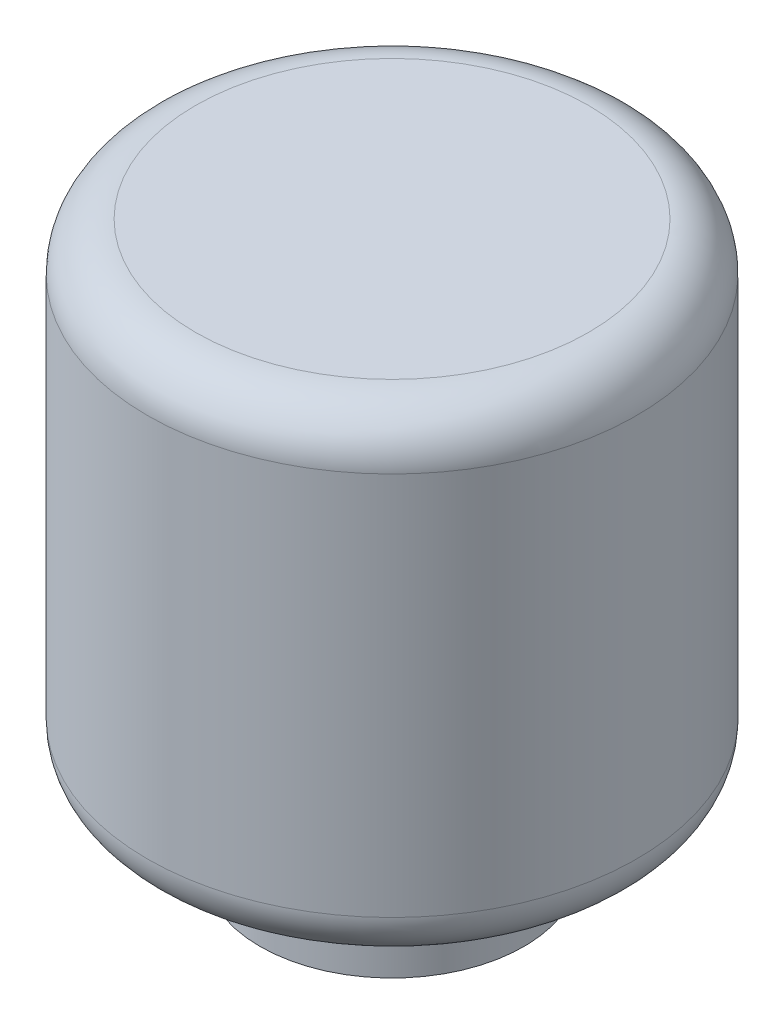
ISO-10303-21;
HEADER;
FILE_DESCRIPTION(('STEP AP214'),'2;1');
FILE_NAME('part.step','',(''),(''),'','','');
FILE_SCHEMA(('AUTOMOTIVE_DESIGN { 1 0 10303 214 1 1 1 1 }'));
ENDSEC;
DATA;
#1=APPLICATION_CONTEXT('core data for automotive mechanical design processes');
#2=APPLICATION_PROTOCOL_DEFINITION('international standard','automotive_design',2000,#1);
#3=PRODUCT_CONTEXT('',#1,'mechanical');
#4=PRODUCT('Part','Part','',(#3));
#5=PRODUCT_RELATED_PRODUCT_CATEGORY('part','',(#4));
#6=PRODUCT_DEFINITION_FORMATION('','',#4);
#7=PRODUCT_DEFINITION_CONTEXT('part definition',#1,'design');
#8=PRODUCT_DEFINITION('design','',#6,#7);
#9=PRODUCT_DEFINITION_SHAPE('','',#8);
#10=(LENGTH_UNIT() NAMED_UNIT(*) SI_UNIT(.MILLI.,.METRE.));
#11=(NAMED_UNIT(*) PLANE_ANGLE_UNIT() SI_UNIT($,.RADIAN.));
#12=(NAMED_UNIT(*) SI_UNIT($,.STERADIAN.) SOLID_ANGLE_UNIT());
#13=UNCERTAINTY_MEASURE_WITH_UNIT(LENGTH_MEASURE(1.E-05),#10,'distance_accuracy_value','');
#14=(GEOMETRIC_REPRESENTATION_CONTEXT(3) GLOBAL_UNCERTAINTY_ASSIGNED_CONTEXT((#13)) GLOBAL_UNIT_ASSIGNED_CONTEXT((#10,
#11,#12)) REPRESENTATION_CONTEXT('',''));
#15=CARTESIAN_POINT('',(0.,0.,0.));
#16=DIRECTION('',(0.,0.,1.));
#17=DIRECTION('',(1.,0.,0.));
#18=AXIS2_PLACEMENT_3D('',#15,#16,#17);
#19=CARTESIAN_POINT('',(0.,-6.68754044623082,0.));
#20=DIRECTION('',(0.,-1.,0.));
#21=DIRECTION('',(0.,0.,-1.));
#22=AXIS2_PLACEMENT_3D('',#19,#20,#21);
#23=CYLINDRICAL_SURFACE('',#22,9.37037036620576);
#24=CARTESIAN_POINT('',(0.,-6.68754044623082,0.));
#25=DIRECTION('',(0.,1.,0.));
#26=DIRECTION('',(0.,0.,1.));
#27=AXIS2_PLACEMENT_3D('',#24,#25,#26);
#28=CIRCLE('',#27,9.37037036620576);
#29=CARTESIAN_POINT('',(0.,-6.68754044623082,9.37037036620576));
#30=VERTEX_POINT('',#29);
#31=EDGE_CURVE('E59',#30,#30,#28,.T.);
#32=ORIENTED_EDGE('',*,*,#31,.F.);
#33=EDGE_LOOP('',(#32));
#34=FACE_BOUND('',#33,.T.);
#35=CARTESIAN_POINT('',(0.,-9.24309600065057,0.));
#36=DIRECTION('',(0.,1.,0.));
#37=DIRECTION('',(0.,0.,1.));
#38=AXIS2_PLACEMENT_3D('',#35,#36,#37);
#39=CIRCLE('',#38,9.37037036620576);
#40=CARTESIAN_POINT('',(0.,-9.24309600065057,9.37037036620576));
#41=VERTEX_POINT('',#40);
#42=EDGE_CURVE('E56',#41,#41,#39,.T.);
#43=ORIENTED_EDGE('',*,*,#42,.T.);
#44=EDGE_LOOP('',(#43));
#45=FACE_BOUND('',#44,.T.);
#46=ADVANCED_FACE('F32',(#34,#45),#23,.T.);
#47=CARTESIAN_POINT('',(0.,-6.68754044623082,0.));
#48=DIRECTION('',(0.,1.,0.));
#49=DIRECTION('',(0.,0.,1.));
#50=AXIS2_PLACEMENT_3D('',#47,#48,#49);
#51=PLANE('',#50);
#52=CARTESIAN_POINT('',(0.,-6.68754044623082,0.));
#53=DIRECTION('',(0.,1.,0.));
#54=DIRECTION('',(0.,0.,1.));
#55=AXIS2_PLACEMENT_3D('',#52,#53,#54);
#56=CIRCLE('',#55,4.25925925736625);
#57=CARTESIAN_POINT('',(0.,-6.68754044623082,4.25925925736625));
#58=VERTEX_POINT('',#57);
#59=EDGE_CURVE('E55',#58,#58,#56,.T.);
#60=ORIENTED_EDGE('',*,*,#59,.F.);
#61=EDGE_LOOP('',(#60));
#62=FACE_BOUND('',#61,.T.);
#63=ORIENTED_EDGE('',*,*,#31,.T.);
#64=EDGE_LOOP('',(#63));
#65=FACE_BOUND('',#64,.T.);
#66=ADVANCED_FACE('F67',(#62,#65),#51,.T.);
#67=CARTESIAN_POINT('',(0.,-9.24309600065057,0.));
#68=DIRECTION('',(0.,1.,0.));
#69=DIRECTION('',(0.,0.,1.));
#70=AXIS2_PLACEMENT_3D('',#67,#68,#69);
#71=PLANE('',#70);
#72=ORIENTED_EDGE('',*,*,#42,.F.);
#73=EDGE_LOOP('',(#72));
#74=FACE_BOUND('',#73,.T.);
#75=ADVANCED_FACE('F70',(#74),#71,.F.);
#76=CARTESIAN_POINT('',(0.,30.7939410185922,0.));
#77=DIRECTION('',(0.,-1.,0.));
#78=DIRECTION('',(0.,0.,-1.));
#79=AXIS2_PLACEMENT_3D('',#76,#77,#78);
#80=CYLINDRICAL_SURFACE('',#79,17.3586592391877);
#81=CARTESIAN_POINT('',(0.,0.127274365555188,0.));
#82=DIRECTION('',(0.,1.,0.));
#83=DIRECTION('',(0.,0.,1.));
#84=AXIS2_PLACEMENT_3D('',#81,#82,#83);
#85=CIRCLE('',#84,17.3586592391877);
#86=CARTESIAN_POINT('',(0.,0.127274365555188,17.3586592391877));
#87=VERTEX_POINT('',#86);
#88=EDGE_CURVE('E43',#87,#87,#85,.T.);
#89=ORIENTED_EDGE('',*,*,#88,.T.);
#90=EDGE_LOOP('',(#89));
#91=FACE_BOUND('',#90,.T.);
#92=CARTESIAN_POINT('',(0.,27.3865336126992,0.));
#93=DIRECTION('',(0.,1.,0.));
#94=DIRECTION('',(0.,0.,1.));
#95=AXIS2_PLACEMENT_3D('',#92,#93,#94);
#96=CIRCLE('',#95,17.3586592391877);
#97=CARTESIAN_POINT('',(0.,27.3865336126992,17.3586592391877));
#98=VERTEX_POINT('',#97);
#99=EDGE_CURVE('E47',#98,#98,#96,.F.);
#100=ORIENTED_EDGE('',*,*,#99,.T.);
#101=EDGE_LOOP('',(#100));
#102=FACE_BOUND('',#101,.T.);
#103=ADVANCED_FACE('F80',(#91,#102),#80,.T.);
#104=CARTESIAN_POINT('',(0.,30.7939410185922,0.));
#105=DIRECTION('',(0.,1.,0.));
#106=DIRECTION('',(0.,0.,1.));
#107=AXIS2_PLACEMENT_3D('',#104,#105,#106);
#108=PLANE('',#107);
#109=CARTESIAN_POINT('',(0.,30.7939410185922,0.));
#110=DIRECTION('',(0.,1.,0.));
#111=DIRECTION('',(0.,0.,1.));
#112=AXIS2_PLACEMENT_3D('',#109,#110,#111);
#113=CIRCLE('',#112,13.9512518332947);
#114=CARTESIAN_POINT('',(0.,30.7939410185922,13.9512518332947));
#115=VERTEX_POINT('',#114);
#116=EDGE_CURVE('E52',#115,#115,#113,.T.);
#117=ORIENTED_EDGE('',*,*,#116,.T.);
#118=EDGE_LOOP('',(#117));
#119=FACE_BOUND('',#118,.T.);
#120=ADVANCED_FACE('F85',(#119),#108,.T.);
#121=CARTESIAN_POINT('',(0.,-3.28013304033781,0.));
#122=DIRECTION('',(0.,1.,0.));
#123=DIRECTION('',(0.,0.,1.));
#124=AXIS2_PLACEMENT_3D('',#121,#122,#123);
#125=PLANE('',#124);
#126=CARTESIAN_POINT('',(0.,-3.28013304033781,0.));
#127=DIRECTION('',(0.,1.,0.));
#128=DIRECTION('',(0.,0.,1.));
#129=AXIS2_PLACEMENT_3D('',#126,#127,#128);
#130=CIRCLE('',#129,13.9512518332947);
#131=CARTESIAN_POINT('',(0.,-3.28013304033781,13.9512518332947));
#132=VERTEX_POINT('',#131);
#133=EDGE_CURVE('E10',#132,#132,#130,.F.);
#134=ORIENTED_EDGE('',*,*,#133,.T.);
#135=EDGE_LOOP('',(#134));
#136=FACE_BOUND('',#135,.T.);
#137=CARTESIAN_POINT('',(0.,-3.28013304033781,0.));
#138=DIRECTION('',(0.,1.,0.));
#139=DIRECTION('',(0.,0.,1.));
#140=AXIS2_PLACEMENT_3D('',#137,#138,#139);
#141=CIRCLE('',#140,7.66666666325926);
#142=CARTESIAN_POINT('',(0.,-3.28013304033781,7.66666666325926));
#143=VERTEX_POINT('',#142);
#144=EDGE_CURVE('E39',#143,#143,#141,.T.);
#145=ORIENTED_EDGE('',*,*,#144,.T.);
#146=EDGE_LOOP('',(#145));
#147=FACE_BOUND('',#146,.T.);
#148=ADVANCED_FACE('F92',(#136,#147),#125,.F.);
#149=CARTESIAN_POINT('',(0.,27.3865336126992,0.));
#150=DIRECTION('',(0.,1.,0.));
#151=DIRECTION('',(0.,0.,1.));
#152=AXIS2_PLACEMENT_3D('',#149,#150,#151);
#153=TOROIDAL_SURFACE('',#152,13.9512518332947,3.407407405893);
#154=ORIENTED_EDGE('',*,*,#99,.F.);
#155=EDGE_LOOP('',(#154));
#156=FACE_BOUND('',#155,.T.);
#157=ORIENTED_EDGE('',*,*,#116,.F.);
#158=EDGE_LOOP('',(#157));
#159=FACE_BOUND('',#158,.T.);
#160=ADVANCED_FACE('F89',(#156,#159),#153,.T.);
#161=CARTESIAN_POINT('',(0.,0.127274365555188,0.));
#162=DIRECTION('',(0.,1.,0.));
#163=DIRECTION('',(0.,0.,1.));
#164=AXIS2_PLACEMENT_3D('',#161,#162,#163);
#165=TOROIDAL_SURFACE('',#164,13.9512518332947,3.407407405893);
#166=ORIENTED_EDGE('',*,*,#133,.F.);
#167=EDGE_LOOP('',(#166));
#168=FACE_BOUND('',#167,.T.);
#169=ORIENTED_EDGE('',*,*,#88,.F.);
#170=EDGE_LOOP('',(#169));
#171=FACE_BOUND('',#170,.T.);
#172=ADVANCED_FACE('F91',(#168,#171),#165,.T.);
#173=CARTESIAN_POINT('',(0.,-6.68754044623082,0.));
#174=DIRECTION('',(0.,1.,0.));
#175=DIRECTION('',(0.,0.,1.));
#176=AXIS2_PLACEMENT_3D('',#173,#174,#175);
#177=TOROIDAL_SURFACE('',#176,7.66666666325926,3.407407405893);
#178=ORIENTED_EDGE('',*,*,#59,.T.);
#179=EDGE_LOOP('',(#178));
#180=FACE_BOUND('',#179,.T.);
#181=ORIENTED_EDGE('',*,*,#144,.F.);
#182=EDGE_LOOP('',(#181));
#183=FACE_BOUND('',#182,.T.);
#184=ADVANCED_FACE('F34',(#180,#183),#177,.F.);
#185=CLOSED_SHELL('',(#46,#66,#75,#103,#120,#148,#160,#172,#184));
#186=MANIFOLD_SOLID_BREP('B2',#185);
#187=ADVANCED_BREP_SHAPE_REPRESENTATION('',(#18,#186),#14);
#188=SHAPE_DEFINITION_REPRESENTATION(#9,#187);
ENDSEC;
END-ISO-10303-21;
